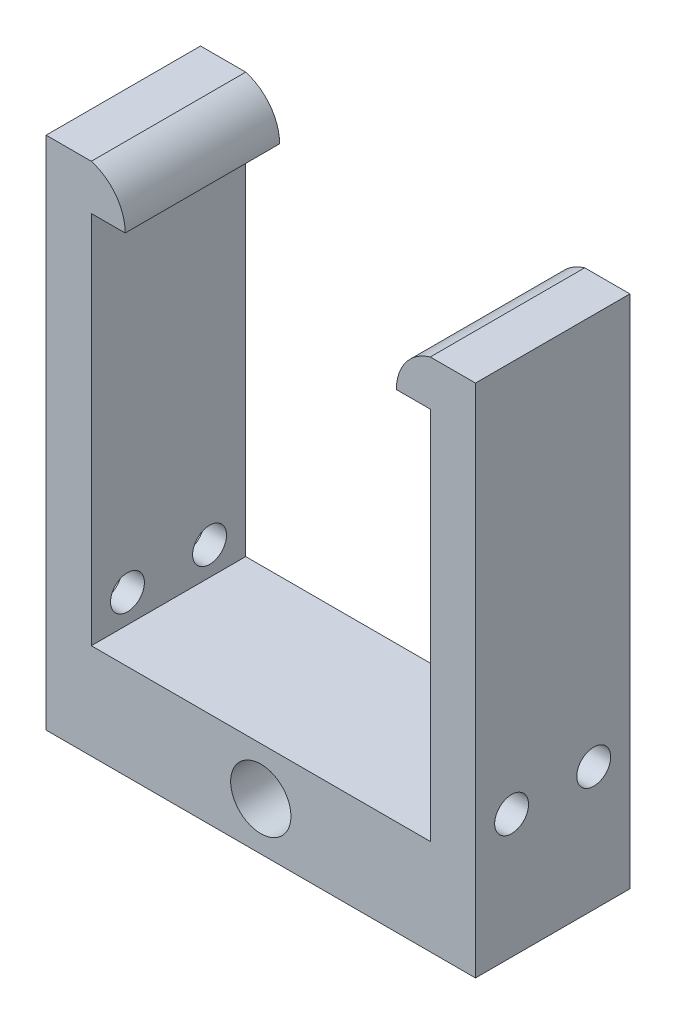
ISO-10303-21;
HEADER;
FILE_DESCRIPTION(('STEP AP214'),'2;1');
FILE_NAME('part.step','',(''),(''),'','','');
FILE_SCHEMA(('AUTOMOTIVE_DESIGN { 1 0 10303 214 1 1 1 1 }'));
ENDSEC;
DATA;
#1=APPLICATION_CONTEXT('core data for automotive mechanical design processes');
#2=APPLICATION_PROTOCOL_DEFINITION('international standard','automotive_design',2000,#1);
#3=PRODUCT_CONTEXT('',#1,'mechanical');
#4=PRODUCT('Part','Part','',(#3));
#5=PRODUCT_RELATED_PRODUCT_CATEGORY('part','',(#4));
#6=PRODUCT_DEFINITION_FORMATION('','',#4);
#7=PRODUCT_DEFINITION_CONTEXT('part definition',#1,'design');
#8=PRODUCT_DEFINITION('design','',#6,#7);
#9=PRODUCT_DEFINITION_SHAPE('','',#8);
#10=(LENGTH_UNIT() NAMED_UNIT(*) SI_UNIT(.MILLI.,.METRE.));
#11=(NAMED_UNIT(*) PLANE_ANGLE_UNIT() SI_UNIT($,.RADIAN.));
#12=(NAMED_UNIT(*) SI_UNIT($,.STERADIAN.) SOLID_ANGLE_UNIT());
#13=UNCERTAINTY_MEASURE_WITH_UNIT(LENGTH_MEASURE(1.E-05),#10,'distance_accuracy_value','');
#14=(GEOMETRIC_REPRESENTATION_CONTEXT(3) GLOBAL_UNCERTAINTY_ASSIGNED_CONTEXT((#13)) GLOBAL_UNIT_ASSIGNED_CONTEXT((#10,
#11,#12)) REPRESENTATION_CONTEXT('',''));
#15=CARTESIAN_POINT('',(0.,0.,0.));
#16=DIRECTION('',(0.,0.,1.));
#17=DIRECTION('',(1.,0.,0.));
#18=AXIS2_PLACEMENT_3D('',#15,#16,#17);
#19=CARTESIAN_POINT('',(-28.5,-43.75,-5.45));
#20=DIRECTION('',(1.,0.,0.));
#21=DIRECTION('',(0.,0.,-1.));
#22=AXIS2_PLACEMENT_3D('',#19,#20,#21);
#23=CYLINDRICAL_SURFACE('',#22,2.25);
#24=CARTESIAN_POINT('',(-22.5,-43.75,-5.45));
#25=DIRECTION('',(-1.,0.,0.));
#26=DIRECTION('',(0.,0.,1.));
#27=AXIS2_PLACEMENT_3D('',#24,#25,#26);
#28=CIRCLE('',#27,2.25);
#29=CARTESIAN_POINT('',(-22.5,-43.75,-3.2));
#30=VERTEX_POINT('',#29);
#31=EDGE_CURVE('E350',#30,#30,#28,.T.);
#32=ORIENTED_EDGE('',*,*,#31,.F.);
#33=EDGE_LOOP('',(#32));
#34=FACE_BOUND('',#33,.T.);
#35=CARTESIAN_POINT('',(-25.5,-43.75,-5.45));
#36=DIRECTION('',(-1.,0.,0.));
#37=DIRECTION('',(0.,0.,1.));
#38=AXIS2_PLACEMENT_3D('',#35,#36,#37);
#39=CIRCLE('',#38,2.25);
#40=CARTESIAN_POINT('',(-25.5,-43.75,-3.2));
#41=VERTEX_POINT('',#40);
#42=EDGE_CURVE('E49',#41,#41,#39,.F.);
#43=ORIENTED_EDGE('',*,*,#42,.F.);
#44=EDGE_LOOP('',(#43));
#45=FACE_BOUND('',#44,.T.);
#46=ADVANCED_FACE('F45',(#34,#45),#23,.F.);
#47=CARTESIAN_POINT('',(-24.25,2.2,10.25));
#48=DIRECTION('',(0.,0.,-1.));
#49=DIRECTION('',(-1.,0.,0.));
#50=AXIS2_PLACEMENT_3D('',#47,#48,#49);
#51=CYLINDRICAL_SURFACE('',#50,6.25);
#52=CARTESIAN_POINT('',(-24.25,2.2,-10.25));
#53=DIRECTION('',(0.,0.,1.));
#54=DIRECTION('',(1.,0.,0.));
#55=AXIS2_PLACEMENT_3D('',#52,#53,#54);
#56=CIRCLE('',#55,6.25);
#57=CARTESIAN_POINT('',(-22.5,8.2,-10.25));
#58=VERTEX_POINT('',#57);
#59=CARTESIAN_POINT('',(-18.,2.2,-10.25));
#60=VERTEX_POINT('',#59);
#61=EDGE_CURVE('E364',#58,#60,#56,.F.);
#62=ORIENTED_EDGE('',*,*,#61,.F.);
#63=DIRECTION('',(0.,0.,-1.));
#64=VECTOR('',#63,1.);
#65=CARTESIAN_POINT('',(-22.5,8.2,10.25));
#66=LINE('',#65,#64);
#67=CARTESIAN_POINT('',(-22.5,8.2,10.25));
#68=VERTEX_POINT('',#67);
#69=EDGE_CURVE('E11',#68,#58,#66,.T.);
#70=ORIENTED_EDGE('',*,*,#69,.F.);
#71=CARTESIAN_POINT('',(-24.25,2.2,10.25));
#72=DIRECTION('',(0.,0.,1.));
#73=DIRECTION('',(1.,0.,0.));
#74=AXIS2_PLACEMENT_3D('',#71,#72,#73);
#75=CIRCLE('',#74,6.25);
#76=CARTESIAN_POINT('',(-18.,2.2,10.25));
#77=VERTEX_POINT('',#76);
#78=EDGE_CURVE('E365',#68,#77,#75,.F.);
#79=ORIENTED_EDGE('',*,*,#78,.T.);
#80=DIRECTION('',(0.,0.,-1.));
#81=VECTOR('',#80,1.);
#82=CARTESIAN_POINT('',(-18.,2.2,10.25));
#83=LINE('',#82,#81);
#84=EDGE_CURVE('E413',#77,#60,#83,.T.);
#85=ORIENTED_EDGE('',*,*,#84,.T.);
#86=EDGE_LOOP('',(#62,#70,#79,#85));
#87=FACE_BOUND('',#86,.T.);
#88=ADVANCED_FACE('F47',(#87),#51,.T.);
#89=CARTESIAN_POINT('',(0.,8.20000000000001,10.25));
#90=DIRECTION('',(0.,1.,0.));
#91=DIRECTION('',(-1.,0.,0.));
#92=AXIS2_PLACEMENT_3D('',#89,#90,#91);
#93=PLANE('',#92);
#94=DIRECTION('',(1.,0.,0.));
#95=VECTOR('',#94,1.);
#96=CARTESIAN_POINT('',(0.,8.20000000000001,-10.25));
#97=LINE('',#96,#95);
#98=CARTESIAN_POINT('',(-28.5,8.2,-10.25));
#99=VERTEX_POINT('',#98);
#100=EDGE_CURVE('E417',#99,#58,#97,.T.);
#101=ORIENTED_EDGE('',*,*,#100,.F.);
#102=DIRECTION('',(0.,0.,-1.));
#103=VECTOR('',#102,1.);
#104=CARTESIAN_POINT('',(-28.5,8.2,10.25));
#105=LINE('',#104,#103);
#106=CARTESIAN_POINT('',(-28.5,8.2,10.25));
#107=VERTEX_POINT('',#106);
#108=EDGE_CURVE('E55',#107,#99,#105,.T.);
#109=ORIENTED_EDGE('',*,*,#108,.F.);
#110=DIRECTION('',(1.,0.,0.));
#111=VECTOR('',#110,1.);
#112=CARTESIAN_POINT('',(0.,8.20000000000001,10.25));
#113=LINE('',#112,#111);
#114=EDGE_CURVE('E369',#107,#68,#113,.T.);
#115=ORIENTED_EDGE('',*,*,#114,.T.);
#116=ORIENTED_EDGE('',*,*,#69,.T.);
#117=EDGE_LOOP('',(#101,#109,#115,#116));
#118=FACE_BOUND('',#117,.T.);
#119=ADVANCED_FACE('F515',(#118),#93,.T.);
#120=CARTESIAN_POINT('',(-28.5,0.,10.25));
#121=DIRECTION('',(-1.,0.,0.));
#122=DIRECTION('',(0.,-1.,0.));
#123=AXIS2_PLACEMENT_3D('',#120,#121,#122);
#124=PLANE('',#123);
#125=DIRECTION('',(0.,0.499999999999977,-0.866025403784452));
#126=VECTOR('',#125,1.);
#127=CARTESIAN_POINT('',(-28.5,-41.8349999999999,-2.13312270350559));
#128=LINE('',#127,#126);
#129=CARTESIAN_POINT('',(-28.5,-41.8349999999999,-2.13312270350559));
#130=VERTEX_POINT('',#129);
#131=CARTESIAN_POINT('',(-28.5,-39.9199999999999,-5.45000000000003));
#132=VERTEX_POINT('',#131);
#133=EDGE_CURVE('E63',#130,#132,#128,.T.);
#134=ORIENTED_EDGE('',*,*,#133,.F.);
#135=DIRECTION('',(0.,1.,0.));
#136=VECTOR('',#135,1.);
#137=CARTESIAN_POINT('',(-28.5,-45.6649999999999,-2.1331227035055));
#138=LINE('',#137,#136);
#139=CARTESIAN_POINT('',(-28.5,-45.6649999999999,-2.1331227035055));
#140=VERTEX_POINT('',#139);
#141=EDGE_CURVE('E233',#140,#130,#138,.T.);
#142=ORIENTED_EDGE('',*,*,#141,.F.);
#143=DIRECTION('',(0.,0.500000000000016,0.86602540378443));
#144=VECTOR('',#143,1.);
#145=CARTESIAN_POINT('',(-28.5,-47.5799999999999,-5.44999999999987));
#146=LINE('',#145,#144);
#147=CARTESIAN_POINT('',(-28.5,-47.5799999999999,-5.44999999999987));
#148=VERTEX_POINT('',#147);
#149=EDGE_CURVE('E237',#148,#140,#146,.T.);
#150=ORIENTED_EDGE('',*,*,#149,.F.);
#151=DIRECTION('',(0.,-0.499999999999966,0.866025403784458));
#152=VECTOR('',#151,1.);
#153=CARTESIAN_POINT('',(-28.5,-45.665,-8.7668772964944));
#154=LINE('',#153,#152);
#155=CARTESIAN_POINT('',(-28.5,-45.665,-8.7668772964944));
#156=VERTEX_POINT('',#155);
#157=EDGE_CURVE('E260',#156,#148,#154,.T.);
#158=ORIENTED_EDGE('',*,*,#157,.F.);
#159=DIRECTION('',(0.,-1.,0.));
#160=VECTOR('',#159,1.);
#161=CARTESIAN_POINT('',(-28.5,-41.835,-8.7668772964944));
#162=LINE('',#161,#160);
#163=CARTESIAN_POINT('',(-28.5,-41.835,-8.7668772964944));
#164=VERTEX_POINT('',#163);
#165=EDGE_CURVE('E256',#164,#156,#162,.T.);
#166=ORIENTED_EDGE('',*,*,#165,.F.);
#167=DIRECTION('',(0.,-0.500000000000022,-0.866025403784426));
#168=VECTOR('',#167,1.);
#169=CARTESIAN_POINT('',(-28.5,-39.9199999999999,-5.45000000000003));
#170=LINE('',#169,#168);
#171=EDGE_CURVE('E253',#132,#164,#170,.T.);
#172=ORIENTED_EDGE('',*,*,#171,.F.);
#173=EDGE_LOOP('',(#134,#142,#150,#158,#166,#172));
#174=FACE_BOUND('',#173,.T.);
#175=DIRECTION('',(0.,1.,0.));
#176=VECTOR('',#175,1.);
#177=CARTESIAN_POINT('',(-28.5,-41.835,8.7668772964944));
#178=LINE('',#177,#176);
#179=CARTESIAN_POINT('',(-28.5,-45.665,8.7668772964944));
#180=VERTEX_POINT('',#179);
#181=CARTESIAN_POINT('',(-28.5,-41.835,8.7668772964944));
#182=VERTEX_POINT('',#181);
#183=EDGE_CURVE('E71',#180,#182,#178,.T.);
#184=ORIENTED_EDGE('',*,*,#183,.F.);
#185=DIRECTION('',(0.,0.5,0.866025403784439));
#186=VECTOR('',#185,1.);
#187=CARTESIAN_POINT('',(-28.5,-45.665,8.7668772964944));
#188=LINE('',#187,#186);
#189=CARTESIAN_POINT('',(-28.5,-47.58,5.45));
#190=VERTEX_POINT('',#189);
#191=EDGE_CURVE('E301',#190,#180,#188,.T.);
#192=ORIENTED_EDGE('',*,*,#191,.F.);
#193=DIRECTION('',(0.,-0.5,0.866025403784439));
#194=VECTOR('',#193,1.);
#195=CARTESIAN_POINT('',(-28.5,-47.58,5.45));
#196=LINE('',#195,#194);
#197=CARTESIAN_POINT('',(-28.5,-45.665,2.1331227035056));
#198=VERTEX_POINT('',#197);
#199=EDGE_CURVE('E305',#198,#190,#196,.T.);
#200=ORIENTED_EDGE('',*,*,#199,.F.);
#201=DIRECTION('',(0.,-1.,0.));
#202=VECTOR('',#201,1.);
#203=CARTESIAN_POINT('',(-28.5,-45.665,2.1331227035056));
#204=LINE('',#203,#202);
#205=CARTESIAN_POINT('',(-28.5,-41.835,2.1331227035056));
#206=VERTEX_POINT('',#205);
#207=EDGE_CURVE('E310',#206,#198,#204,.T.);
#208=ORIENTED_EDGE('',*,*,#207,.F.);
#209=DIRECTION('',(0.,-0.5,-0.866025403784439));
#210=VECTOR('',#209,1.);
#211=CARTESIAN_POINT('',(-28.5,-41.835,2.1331227035056));
#212=LINE('',#211,#210);
#213=CARTESIAN_POINT('',(-28.5,-39.92,5.45));
#214=VERTEX_POINT('',#213);
#215=EDGE_CURVE('E314',#214,#206,#212,.T.);
#216=ORIENTED_EDGE('',*,*,#215,.F.);
#217=DIRECTION('',(0.,0.5,-0.866025403784439));
#218=VECTOR('',#217,1.);
#219=CARTESIAN_POINT('',(-28.5,-39.92,5.45));
#220=LINE('',#219,#218);
#221=EDGE_CURVE('E318',#182,#214,#220,.T.);
#222=ORIENTED_EDGE('',*,*,#221,.F.);
#223=EDGE_LOOP('',(#184,#192,#200,#208,#216,#222));
#224=FACE_BOUND('',#223,.T.);
#225=DIRECTION('',(0.,1.,0.));
#226=VECTOR('',#225,1.);
#227=CARTESIAN_POINT('',(-28.5,0.,-10.25));
#228=LINE('',#227,#226);
#229=CARTESIAN_POINT('',(-28.5,-60.2,-10.25));
#230=VERTEX_POINT('',#229);
#231=EDGE_CURVE('E421',#230,#99,#228,.T.);
#232=ORIENTED_EDGE('',*,*,#231,.F.);
#233=DIRECTION('',(0.,0.,-1.));
#234=VECTOR('',#233,1.);
#235=CARTESIAN_POINT('',(-28.5,-60.2,10.25));
#236=LINE('',#235,#234);
#237=CARTESIAN_POINT('',(-28.5,-60.2,10.25));
#238=VERTEX_POINT('',#237);
#239=EDGE_CURVE('E490',#238,#230,#236,.T.);
#240=ORIENTED_EDGE('',*,*,#239,.F.);
#241=DIRECTION('',(0.,1.,0.));
#242=VECTOR('',#241,1.);
#243=CARTESIAN_POINT('',(-28.5,0.,10.25));
#244=LINE('',#243,#242);
#245=EDGE_CURVE('E374',#238,#107,#244,.T.);
#246=ORIENTED_EDGE('',*,*,#245,.T.);
#247=ORIENTED_EDGE('',*,*,#108,.T.);
#248=EDGE_LOOP('',(#232,#240,#246,#247));
#249=FACE_BOUND('',#248,.T.);
#250=ADVANCED_FACE('F575',(#174,#224,#249),#124,.T.);
#251=CARTESIAN_POINT('',(0.,-60.2,10.25));
#252=DIRECTION('',(0.,-1.,0.));
#253=DIRECTION('',(0.,0.,-1.));
#254=AXIS2_PLACEMENT_3D('',#251,#252,#253);
#255=PLANE('',#254);
#256=DIRECTION('',(-1.,0.,0.));
#257=VECTOR('',#256,1.);
#258=CARTESIAN_POINT('',(0.,-60.2,-10.25));
#259=LINE('',#258,#257);
#260=CARTESIAN_POINT('',(28.5,-60.2,-10.25));
#261=VERTEX_POINT('',#260);
#262=EDGE_CURVE('E425',#261,#230,#259,.T.);
#263=ORIENTED_EDGE('',*,*,#262,.F.);
#264=DIRECTION('',(0.,0.,-1.));
#265=VECTOR('',#264,1.);
#266=CARTESIAN_POINT('',(28.5,-60.2,10.25));
#267=LINE('',#266,#265);
#268=CARTESIAN_POINT('',(28.5,-60.2,10.25));
#269=VERTEX_POINT('',#268);
#270=EDGE_CURVE('E487',#269,#261,#267,.T.);
#271=ORIENTED_EDGE('',*,*,#270,.F.);
#272=DIRECTION('',(-1.,0.,0.));
#273=VECTOR('',#272,1.);
#274=CARTESIAN_POINT('',(0.,-60.2,10.25));
#275=LINE('',#274,#273);
#276=EDGE_CURVE('E378',#269,#238,#275,.T.);
#277=ORIENTED_EDGE('',*,*,#276,.T.);
#278=ORIENTED_EDGE('',*,*,#239,.T.);
#279=EDGE_LOOP('',(#263,#271,#277,#278));
#280=FACE_BOUND('',#279,.T.);
#281=ADVANCED_FACE('F539',(#280),#255,.T.);
#282=CARTESIAN_POINT('',(28.5,0.,10.25));
#283=DIRECTION('',(-1.,0.,0.));
#284=DIRECTION('',(0.,0.,1.));
#285=AXIS2_PLACEMENT_3D('',#282,#283,#284);
#286=PLANE('',#285);
#287=CARTESIAN_POINT('',(28.5,-43.75,5.45));
#288=DIRECTION('',(1.,0.,0.));
#289=DIRECTION('',(0.,0.,-1.));
#290=AXIS2_PLACEMENT_3D('',#287,#288,#289);
#291=CIRCLE('',#290,2.25);
#292=CARTESIAN_POINT('',(28.5,-43.75,3.2));
#293=VERTEX_POINT('',#292);
#294=EDGE_CURVE('E346',#293,#293,#291,.T.);
#295=ORIENTED_EDGE('',*,*,#294,.F.);
#296=EDGE_LOOP('',(#295));
#297=FACE_BOUND('',#296,.T.);
#298=CARTESIAN_POINT('',(28.5,-43.75,-5.45));
#299=DIRECTION('',(1.,0.,0.));
#300=DIRECTION('',(0.,0.,1.));
#301=AXIS2_PLACEMENT_3D('',#298,#299,#300);
#302=CIRCLE('',#301,2.25);
#303=CARTESIAN_POINT('',(28.5,-43.75,-3.2));
#304=VERTEX_POINT('',#303);
#305=EDGE_CURVE('E351',#304,#304,#302,.T.);
#306=ORIENTED_EDGE('',*,*,#305,.F.);
#307=EDGE_LOOP('',(#306));
#308=FACE_BOUND('',#307,.T.);
#309=DIRECTION('',(0.,1.,0.));
#310=VECTOR('',#309,1.);
#311=CARTESIAN_POINT('',(28.5,0.,-10.25));
#312=LINE('',#311,#310);
#313=CARTESIAN_POINT('',(28.5,8.2,-10.25));
#314=VERTEX_POINT('',#313);
#315=EDGE_CURVE('E429',#261,#314,#312,.T.);
#316=ORIENTED_EDGE('',*,*,#315,.T.);
#317=DIRECTION('',(0.,0.,-1.));
#318=VECTOR('',#317,1.);
#319=CARTESIAN_POINT('',(28.5,8.2,10.25));
#320=LINE('',#319,#318);
#321=CARTESIAN_POINT('',(28.5,8.2,10.25));
#322=VERTEX_POINT('',#321);
#323=EDGE_CURVE('E483',#322,#314,#320,.T.);
#324=ORIENTED_EDGE('',*,*,#323,.F.);
#325=DIRECTION('',(0.,1.,0.));
#326=VECTOR('',#325,1.);
#327=CARTESIAN_POINT('',(28.5,0.,10.25));
#328=LINE('',#327,#326);
#329=EDGE_CURVE('E382',#269,#322,#328,.T.);
#330=ORIENTED_EDGE('',*,*,#329,.F.);
#331=ORIENTED_EDGE('',*,*,#270,.T.);
#332=EDGE_LOOP('',(#316,#324,#330,#331));
#333=FACE_BOUND('',#332,.T.);
#334=ADVANCED_FACE('F535',(#297,#308,#333),#286,.F.);
#335=CARTESIAN_POINT('',(0.,8.20000000000001,10.25));
#336=DIRECTION('',(0.,-1.,0.));
#337=DIRECTION('',(1.,0.,0.));
#338=AXIS2_PLACEMENT_3D('',#335,#336,#337);
#339=PLANE('',#338);
#340=DIRECTION('',(-1.,0.,0.));
#341=VECTOR('',#340,1.);
#342=CARTESIAN_POINT('',(0.,8.20000000000001,-10.25));
#343=LINE('',#342,#341);
#344=CARTESIAN_POINT('',(22.5,8.2,-10.25));
#345=VERTEX_POINT('',#344);
#346=EDGE_CURVE('E432',#314,#345,#343,.T.);
#347=ORIENTED_EDGE('',*,*,#346,.T.);
#348=DIRECTION('',(0.,0.,-1.));
#349=VECTOR('',#348,1.);
#350=CARTESIAN_POINT('',(22.5,8.2,10.25));
#351=LINE('',#350,#349);
#352=CARTESIAN_POINT('',(22.5,8.2,10.25));
#353=VERTEX_POINT('',#352);
#354=EDGE_CURVE('E479',#353,#345,#351,.T.);
#355=ORIENTED_EDGE('',*,*,#354,.F.);
#356=DIRECTION('',(-1.,0.,0.));
#357=VECTOR('',#356,1.);
#358=CARTESIAN_POINT('',(0.,8.20000000000001,10.25));
#359=LINE('',#358,#357);
#360=EDGE_CURVE('E385',#322,#353,#359,.T.);
#361=ORIENTED_EDGE('',*,*,#360,.F.);
#362=ORIENTED_EDGE('',*,*,#323,.T.);
#363=EDGE_LOOP('',(#347,#355,#361,#362));
#364=FACE_BOUND('',#363,.T.);
#365=ADVANCED_FACE('F538',(#364),#339,.F.);
#366=CARTESIAN_POINT('',(24.25,2.2,10.25));
#367=DIRECTION('',(0.,0.,-1.));
#368=DIRECTION('',(-1.,0.,0.));
#369=AXIS2_PLACEMENT_3D('',#366,#367,#368);
#370=CYLINDRICAL_SURFACE('',#369,6.25);
#371=CARTESIAN_POINT('',(24.25,2.2,-10.25));
#372=DIRECTION('',(0.,0.,1.));
#373=DIRECTION('',(1.,0.,0.));
#374=AXIS2_PLACEMENT_3D('',#371,#372,#373);
#375=CIRCLE('',#374,6.25);
#376=CARTESIAN_POINT('',(18.,2.2,-10.25));
#377=VERTEX_POINT('',#376);
#378=EDGE_CURVE('E435',#345,#377,#375,.T.);
#379=ORIENTED_EDGE('',*,*,#378,.T.);
#380=DIRECTION('',(0.,0.,-1.));
#381=VECTOR('',#380,1.);
#382=CARTESIAN_POINT('',(18.,2.2,10.25));
#383=LINE('',#382,#381);
#384=CARTESIAN_POINT('',(18.,2.2,10.25));
#385=VERTEX_POINT('',#384);
#386=EDGE_CURVE('E475',#385,#377,#383,.T.);
#387=ORIENTED_EDGE('',*,*,#386,.F.);
#388=CARTESIAN_POINT('',(24.25,2.2,10.25));
#389=DIRECTION('',(0.,0.,1.));
#390=DIRECTION('',(1.,0.,0.));
#391=AXIS2_PLACEMENT_3D('',#388,#389,#390);
#392=CIRCLE('',#391,6.25);
#393=EDGE_CURVE('E388',#353,#385,#392,.T.);
#394=ORIENTED_EDGE('',*,*,#393,.F.);
#395=ORIENTED_EDGE('',*,*,#354,.T.);
#396=EDGE_LOOP('',(#379,#387,#394,#395));
#397=FACE_BOUND('',#396,.T.);
#398=ADVANCED_FACE('F556',(#397),#370,.T.);
#399=CARTESIAN_POINT('',(0.,2.19999999999999,10.25));
#400=DIRECTION('',(0.,1.,0.));
#401=DIRECTION('',(-1.,0.,0.));
#402=AXIS2_PLACEMENT_3D('',#399,#400,#401);
#403=PLANE('',#402);
#404=DIRECTION('',(1.,0.,0.));
#405=VECTOR('',#404,1.);
#406=CARTESIAN_POINT('',(0.,2.19999999999999,-10.25));
#407=LINE('',#406,#405);
#408=CARTESIAN_POINT('',(22.5,2.2,-10.25));
#409=VERTEX_POINT('',#408);
#410=EDGE_CURVE('E438',#377,#409,#407,.T.);
#411=ORIENTED_EDGE('',*,*,#410,.T.);
#412=DIRECTION('',(0.,0.,-1.));
#413=VECTOR('',#412,1.);
#414=CARTESIAN_POINT('',(22.5,2.2,10.25));
#415=LINE('',#414,#413);
#416=CARTESIAN_POINT('',(22.5,2.2,10.25));
#417=VERTEX_POINT('',#416);
#418=EDGE_CURVE('E472',#417,#409,#415,.T.);
#419=ORIENTED_EDGE('',*,*,#418,.F.);
#420=DIRECTION('',(1.,0.,0.));
#421=VECTOR('',#420,1.);
#422=CARTESIAN_POINT('',(0.,2.19999999999999,10.25));
#423=LINE('',#422,#421);
#424=EDGE_CURVE('E391',#385,#417,#423,.T.);
#425=ORIENTED_EDGE('',*,*,#424,.F.);
#426=ORIENTED_EDGE('',*,*,#386,.T.);
#427=EDGE_LOOP('',(#411,#419,#425,#426));
#428=FACE_BOUND('',#427,.T.);
#429=ADVANCED_FACE('F560',(#428),#403,.F.);
#430=CARTESIAN_POINT('',(22.5,0.,10.25));
#431=DIRECTION('',(-1.,0.,0.));
#432=DIRECTION('',(0.,0.,1.));
#433=AXIS2_PLACEMENT_3D('',#430,#431,#432);
#434=PLANE('',#433);
#435=CARTESIAN_POINT('',(22.5,-43.75,5.45));
#436=DIRECTION('',(-1.,0.,0.));
#437=DIRECTION('',(0.,0.,1.));
#438=AXIS2_PLACEMENT_3D('',#435,#436,#437);
#439=CIRCLE('',#438,2.25);
#440=CARTESIAN_POINT('',(22.5,-43.75,7.7));
#441=VERTEX_POINT('',#440);
#442=EDGE_CURVE('E360',#441,#441,#439,.T.);
#443=ORIENTED_EDGE('',*,*,#442,.F.);
#444=EDGE_LOOP('',(#443));
#445=FACE_BOUND('',#444,.T.);
#446=CARTESIAN_POINT('',(22.5,-43.75,-5.45));
#447=DIRECTION('',(-1.,0.,0.));
#448=DIRECTION('',(0.,0.,1.));
#449=AXIS2_PLACEMENT_3D('',#446,#447,#448);
#450=CIRCLE('',#449,2.25);
#451=CARTESIAN_POINT('',(22.5,-43.75,-3.2));
#452=VERTEX_POINT('',#451);
#453=EDGE_CURVE('E355',#452,#452,#450,.T.);
#454=ORIENTED_EDGE('',*,*,#453,.F.);
#455=EDGE_LOOP('',(#454));
#456=FACE_BOUND('',#455,.T.);
#457=DIRECTION('',(0.,1.,0.));
#458=VECTOR('',#457,1.);
#459=CARTESIAN_POINT('',(22.5,0.,-10.25));
#460=LINE('',#459,#458);
#461=CARTESIAN_POINT('',(22.5,-47.5,-10.25));
#462=VERTEX_POINT('',#461);
#463=EDGE_CURVE('E442',#462,#409,#460,.T.);
#464=ORIENTED_EDGE('',*,*,#463,.F.);
#465=DIRECTION('',(0.,0.,-1.));
#466=VECTOR('',#465,1.);
#467=CARTESIAN_POINT('',(22.5,-47.5,10.25));
#468=LINE('',#467,#466);
#469=CARTESIAN_POINT('',(22.5,-47.5,10.25));
#470=VERTEX_POINT('',#469);
#471=EDGE_CURVE('E469',#470,#462,#468,.T.);
#472=ORIENTED_EDGE('',*,*,#471,.F.);
#473=DIRECTION('',(0.,1.,0.));
#474=VECTOR('',#473,1.);
#475=CARTESIAN_POINT('',(22.5,0.,10.25));
#476=LINE('',#475,#474);
#477=EDGE_CURVE('E394',#470,#417,#476,.T.);
#478=ORIENTED_EDGE('',*,*,#477,.T.);
#479=ORIENTED_EDGE('',*,*,#418,.T.);
#480=EDGE_LOOP('',(#464,#472,#478,#479));
#481=FACE_BOUND('',#480,.T.);
#482=ADVANCED_FACE('F592',(#445,#456,#481),#434,.T.);
#483=CARTESIAN_POINT('',(0.,-47.5,10.25));
#484=DIRECTION('',(0.,1.,0.));
#485=DIRECTION('',(0.,0.,1.));
#486=AXIS2_PLACEMENT_3D('',#483,#484,#485);
#487=PLANE('',#486);
#488=DIRECTION('',(1.,0.,0.));
#489=VECTOR('',#488,1.);
#490=CARTESIAN_POINT('',(0.,-47.5,-10.25));
#491=LINE('',#490,#489);
#492=CARTESIAN_POINT('',(-22.5,-47.5,-10.25));
#493=VERTEX_POINT('',#492);
#494=EDGE_CURVE('E446',#493,#462,#491,.T.);
#495=ORIENTED_EDGE('',*,*,#494,.F.);
#496=DIRECTION('',(0.,0.,-1.));
#497=VECTOR('',#496,1.);
#498=CARTESIAN_POINT('',(-22.5,-47.5,10.25));
#499=LINE('',#498,#497);
#500=CARTESIAN_POINT('',(-22.5,-47.5,10.25));
#501=VERTEX_POINT('',#500);
#502=EDGE_CURVE('E466',#501,#493,#499,.T.);
#503=ORIENTED_EDGE('',*,*,#502,.F.);
#504=DIRECTION('',(1.,0.,0.));
#505=VECTOR('',#504,1.);
#506=CARTESIAN_POINT('',(0.,-47.5,10.25));
#507=LINE('',#506,#505);
#508=EDGE_CURVE('E398',#501,#470,#507,.T.);
#509=ORIENTED_EDGE('',*,*,#508,.T.);
#510=ORIENTED_EDGE('',*,*,#471,.T.);
#511=EDGE_LOOP('',(#495,#503,#509,#510));
#512=FACE_BOUND('',#511,.T.);
#513=ADVANCED_FACE('F589',(#512),#487,.T.);
#514=CARTESIAN_POINT('',(-22.5,0.,10.25));
#515=DIRECTION('',(-1.,0.,0.));
#516=DIRECTION('',(0.,0.,1.));
#517=AXIS2_PLACEMENT_3D('',#514,#515,#516);
#518=PLANE('',#517);
#519=CARTESIAN_POINT('',(-22.5,-43.75,5.45));
#520=DIRECTION('',(-1.,0.,0.));
#521=DIRECTION('',(0.,0.,1.));
#522=AXIS2_PLACEMENT_3D('',#519,#520,#521);
#523=CIRCLE('',#522,2.25);
#524=CARTESIAN_POINT('',(-22.5,-43.75,7.7));
#525=VERTEX_POINT('',#524);
#526=EDGE_CURVE('E359',#525,#525,#523,.T.);
#527=ORIENTED_EDGE('',*,*,#526,.T.);
#528=EDGE_LOOP('',(#527));
#529=FACE_BOUND('',#528,.T.);
#530=ORIENTED_EDGE('',*,*,#31,.T.);
#531=EDGE_LOOP('',(#530));
#532=FACE_BOUND('',#531,.T.);
#533=DIRECTION('',(0.,1.,0.));
#534=VECTOR('',#533,1.);
#535=CARTESIAN_POINT('',(-22.5,0.,-10.25));
#536=LINE('',#535,#534);
#537=CARTESIAN_POINT('',(-22.5,2.2,-10.25));
#538=VERTEX_POINT('',#537);
#539=EDGE_CURVE('E450',#493,#538,#536,.T.);
#540=ORIENTED_EDGE('',*,*,#539,.T.);
#541=DIRECTION('',(0.,0.,-1.));
#542=VECTOR('',#541,1.);
#543=CARTESIAN_POINT('',(-22.5,2.2,10.25));
#544=LINE('',#543,#542);
#545=CARTESIAN_POINT('',(-22.5,2.2,10.25));
#546=VERTEX_POINT('',#545);
#547=EDGE_CURVE('E463',#546,#538,#544,.T.);
#548=ORIENTED_EDGE('',*,*,#547,.F.);
#549=DIRECTION('',(0.,1.,0.));
#550=VECTOR('',#549,1.);
#551=CARTESIAN_POINT('',(-22.5,0.,10.25));
#552=LINE('',#551,#550);
#553=EDGE_CURVE('E402',#501,#546,#552,.T.);
#554=ORIENTED_EDGE('',*,*,#553,.F.);
#555=ORIENTED_EDGE('',*,*,#502,.T.);
#556=EDGE_LOOP('',(#540,#548,#554,#555));
#557=FACE_BOUND('',#556,.T.);
#558=ADVANCED_FACE('F586',(#529,#532,#557),#518,.F.);
#559=CARTESIAN_POINT('',(0.,2.19999999999999,10.25));
#560=DIRECTION('',(0.,-1.,0.));
#561=DIRECTION('',(1.,0.,0.));
#562=AXIS2_PLACEMENT_3D('',#559,#560,#561);
#563=PLANE('',#562);
#564=DIRECTION('',(-1.,0.,0.));
#565=VECTOR('',#564,1.);
#566=CARTESIAN_POINT('',(0.,2.19999999999999,-10.25));
#567=LINE('',#566,#565);
#568=EDGE_CURVE('E454',#60,#538,#567,.T.);
#569=ORIENTED_EDGE('',*,*,#568,.F.);
#570=ORIENTED_EDGE('',*,*,#84,.F.);
#571=DIRECTION('',(-1.,0.,0.));
#572=VECTOR('',#571,1.);
#573=CARTESIAN_POINT('',(0.,2.19999999999999,10.25));
#574=LINE('',#573,#572);
#575=EDGE_CURVE('E405',#77,#546,#574,.T.);
#576=ORIENTED_EDGE('',*,*,#575,.T.);
#577=ORIENTED_EDGE('',*,*,#547,.T.);
#578=EDGE_LOOP('',(#569,#570,#576,#577));
#579=FACE_BOUND('',#578,.T.);
#580=ADVANCED_FACE('F581',(#579),#563,.T.);
#581=CARTESIAN_POINT('',(0.,-53.85,10.25));
#582=DIRECTION('',(0.,0.,-1.));
#583=DIRECTION('',(-1.,0.,0.));
#584=AXIS2_PLACEMENT_3D('',#581,#582,#583);
#585=CYLINDRICAL_SURFACE('',#584,4.);
#586=CARTESIAN_POINT('',(0.,-53.85,10.25));
#587=DIRECTION('',(0.,0.,1.));
#588=DIRECTION('',(1.,0.,0.));
#589=AXIS2_PLACEMENT_3D('',#586,#587,#588);
#590=CIRCLE('',#589,4.);
#591=CARTESIAN_POINT('',(4.,-53.85,10.25));
#592=VERTEX_POINT('',#591);
#593=EDGE_CURVE('E409',#592,#592,#590,.T.);
#594=ORIENTED_EDGE('',*,*,#593,.T.);
#595=EDGE_LOOP('',(#594));
#596=FACE_BOUND('',#595,.T.);
#597=CARTESIAN_POINT('',(0.,-53.85,-10.25));
#598=DIRECTION('',(0.,0.,1.));
#599=DIRECTION('',(1.,0.,0.));
#600=AXIS2_PLACEMENT_3D('',#597,#598,#599);
#601=CIRCLE('',#600,4.);
#602=CARTESIAN_POINT('',(4.,-53.85,-10.25));
#603=VERTEX_POINT('',#602);
#604=EDGE_CURVE('E370',#603,#603,#601,.T.);
#605=ORIENTED_EDGE('',*,*,#604,.F.);
#606=EDGE_LOOP('',(#605));
#607=FACE_BOUND('',#606,.T.);
#608=ADVANCED_FACE('F696',(#596,#607),#585,.F.);
#609=CARTESIAN_POINT('',(0.,0.,10.25));
#610=DIRECTION('',(0.,0.,1.));
#611=DIRECTION('',(1.,0.,0.));
#612=AXIS2_PLACEMENT_3D('',#609,#610,#611);
#613=PLANE('',#612);
#614=ORIENTED_EDGE('',*,*,#78,.F.);
#615=ORIENTED_EDGE('',*,*,#114,.F.);
#616=ORIENTED_EDGE('',*,*,#245,.F.);
#617=ORIENTED_EDGE('',*,*,#276,.F.);
#618=ORIENTED_EDGE('',*,*,#329,.T.);
#619=ORIENTED_EDGE('',*,*,#360,.T.);
#620=ORIENTED_EDGE('',*,*,#393,.T.);
#621=ORIENTED_EDGE('',*,*,#424,.T.);
#622=ORIENTED_EDGE('',*,*,#477,.F.);
#623=ORIENTED_EDGE('',*,*,#508,.F.);
#624=ORIENTED_EDGE('',*,*,#553,.T.);
#625=ORIENTED_EDGE('',*,*,#575,.F.);
#626=EDGE_LOOP('',(#614,#615,#616,#617,#618,#619,#620,#621,#622,#623,#624,#625));
#627=FACE_BOUND('',#626,.T.);
#628=ORIENTED_EDGE('',*,*,#593,.F.);
#629=EDGE_LOOP('',(#628));
#630=FACE_BOUND('',#629,.T.);
#631=ADVANCED_FACE('F565',(#627,#630),#613,.T.);
#632=CARTESIAN_POINT('',(0.,0.,-10.25));
#633=DIRECTION('',(0.,0.,1.));
#634=DIRECTION('',(1.,0.,0.));
#635=AXIS2_PLACEMENT_3D('',#632,#633,#634);
#636=PLANE('',#635);
#637=ORIENTED_EDGE('',*,*,#61,.T.);
#638=ORIENTED_EDGE('',*,*,#568,.T.);
#639=ORIENTED_EDGE('',*,*,#539,.F.);
#640=ORIENTED_EDGE('',*,*,#494,.T.);
#641=ORIENTED_EDGE('',*,*,#463,.T.);
#642=ORIENTED_EDGE('',*,*,#410,.F.);
#643=ORIENTED_EDGE('',*,*,#378,.F.);
#644=ORIENTED_EDGE('',*,*,#346,.F.);
#645=ORIENTED_EDGE('',*,*,#315,.F.);
#646=ORIENTED_EDGE('',*,*,#262,.T.);
#647=ORIENTED_EDGE('',*,*,#231,.T.);
#648=ORIENTED_EDGE('',*,*,#100,.T.);
#649=EDGE_LOOP('',(#637,#638,#639,#640,#641,#642,#643,#644,#645,#646,#647,#648));
#650=FACE_BOUND('',#649,.T.);
#651=ORIENTED_EDGE('',*,*,#604,.T.);
#652=EDGE_LOOP('',(#651));
#653=FACE_BOUND('',#652,.T.);
#654=ADVANCED_FACE('F530',(#650,#653),#636,.F.);
#655=CARTESIAN_POINT('',(-28.5,-43.75,5.45));
#656=DIRECTION('',(1.,0.,0.));
#657=DIRECTION('',(0.,0.,-1.));
#658=AXIS2_PLACEMENT_3D('',#655,#656,#657);
#659=CYLINDRICAL_SURFACE('',#658,2.25);
#660=CARTESIAN_POINT('',(-25.5,-43.75,5.45));
#661=DIRECTION('',(1.,0.,0.));
#662=DIRECTION('',(0.,1.,0.));
#663=AXIS2_PLACEMENT_3D('',#660,#661,#662);
#664=CIRCLE('',#663,2.25);
#665=CARTESIAN_POINT('',(-25.5,-41.5,5.45));
#666=VERTEX_POINT('',#665);
#667=EDGE_CURVE('E270',#666,#666,#664,.F.);
#668=ORIENTED_EDGE('',*,*,#667,.T.);
#669=EDGE_LOOP('',(#668));
#670=FACE_BOUND('',#669,.T.);
#671=ORIENTED_EDGE('',*,*,#526,.F.);
#672=EDGE_LOOP('',(#671));
#673=FACE_BOUND('',#672,.T.);
#674=ADVANCED_FACE('F522',(#670,#673),#659,.F.);
#675=ORIENTED_EDGE('',*,*,#453,.T.);
#676=EDGE_LOOP('',(#675));
#677=FACE_BOUND('',#676,.T.);
#678=ORIENTED_EDGE('',*,*,#305,.T.);
#679=EDGE_LOOP('',(#678));
#680=FACE_BOUND('',#679,.T.);
#681=ADVANCED_FACE('F511',(#677,#680),#23,.F.);
#682=ORIENTED_EDGE('',*,*,#442,.T.);
#683=EDGE_LOOP('',(#682));
#684=FACE_BOUND('',#683,.T.);
#685=ORIENTED_EDGE('',*,*,#294,.T.);
#686=EDGE_LOOP('',(#685));
#687=FACE_BOUND('',#686,.T.);
#688=ADVANCED_FACE('F521',(#684,#687),#659,.F.);
#689=CARTESIAN_POINT('',(-25.5,0.,0.));
#690=DIRECTION('',(1.,0.,0.));
#691=DIRECTION('',(0.,1.,0.));
#692=AXIS2_PLACEMENT_3D('',#689,#690,#691);
#693=PLANE('',#692);
#694=DIRECTION('',(0.,1.,0.));
#695=VECTOR('',#694,1.);
#696=CARTESIAN_POINT('',(-25.5,-41.835,8.7668772964944));
#697=LINE('',#696,#695);
#698=CARTESIAN_POINT('',(-25.5,-45.665,8.7668772964944));
#699=VERTEX_POINT('',#698);
#700=CARTESIAN_POINT('',(-25.5,-41.835,8.7668772964944));
#701=VERTEX_POINT('',#700);
#702=EDGE_CURVE('E306',#699,#701,#697,.T.);
#703=ORIENTED_EDGE('',*,*,#702,.T.);
#704=DIRECTION('',(0.,0.5,-0.866025403784439));
#705=VECTOR('',#704,1.);
#706=CARTESIAN_POINT('',(-25.5,-39.92,5.45));
#707=LINE('',#706,#705);
#708=CARTESIAN_POINT('',(-25.5,-39.92,5.45));
#709=VERTEX_POINT('',#708);
#710=EDGE_CURVE('E339',#701,#709,#707,.T.);
#711=ORIENTED_EDGE('',*,*,#710,.T.);
#712=DIRECTION('',(0.,-0.5,-0.866025403784439));
#713=VECTOR('',#712,1.);
#714=CARTESIAN_POINT('',(-25.5,-41.835,2.1331227035056));
#715=LINE('',#714,#713);
#716=CARTESIAN_POINT('',(-25.5,-41.835,2.1331227035056));
#717=VERTEX_POINT('',#716);
#718=EDGE_CURVE('E335',#709,#717,#715,.T.);
#719=ORIENTED_EDGE('',*,*,#718,.T.);
#720=DIRECTION('',(0.,-1.,0.));
#721=VECTOR('',#720,1.);
#722=CARTESIAN_POINT('',(-25.5,-45.665,2.1331227035056));
#723=LINE('',#722,#721);
#724=CARTESIAN_POINT('',(-25.5,-45.665,2.1331227035056));
#725=VERTEX_POINT('',#724);
#726=EDGE_CURVE('E331',#717,#725,#723,.T.);
#727=ORIENTED_EDGE('',*,*,#726,.T.);
#728=DIRECTION('',(0.,-0.5,0.866025403784439));
#729=VECTOR('',#728,1.);
#730=CARTESIAN_POINT('',(-25.5,-47.58,5.45));
#731=LINE('',#730,#729);
#732=CARTESIAN_POINT('',(-25.5,-47.58,5.45));
#733=VERTEX_POINT('',#732);
#734=EDGE_CURVE('E327',#725,#733,#731,.T.);
#735=ORIENTED_EDGE('',*,*,#734,.T.);
#736=DIRECTION('',(0.,0.5,0.866025403784439));
#737=VECTOR('',#736,1.);
#738=CARTESIAN_POINT('',(-25.5,-45.665,8.7668772964944));
#739=LINE('',#738,#737);
#740=EDGE_CURVE('E285',#733,#699,#739,.T.);
#741=ORIENTED_EDGE('',*,*,#740,.T.);
#742=EDGE_LOOP('',(#703,#711,#719,#727,#735,#741));
#743=FACE_BOUND('',#742,.T.);
#744=ORIENTED_EDGE('',*,*,#667,.F.);
#745=EDGE_LOOP('',(#744));
#746=FACE_BOUND('',#745,.T.);
#747=ADVANCED_FACE('F528',(#743,#746),#693,.F.);
#748=CARTESIAN_POINT('',(-25.5,-41.835,8.7668772964944));
#749=DIRECTION('',(0.,0.,1.));
#750=DIRECTION('',(1.,0.,0.));
#751=AXIS2_PLACEMENT_3D('',#748,#749,#750);
#752=PLANE('',#751);
#753=ORIENTED_EDGE('',*,*,#183,.T.);
#754=DIRECTION('',(-1.,0.,0.));
#755=VECTOR('',#754,1.);
#756=CARTESIAN_POINT('',(-25.5,-41.835,8.7668772964944));
#757=LINE('',#756,#755);
#758=EDGE_CURVE('E282',#701,#182,#757,.T.);
#759=ORIENTED_EDGE('',*,*,#758,.F.);
#760=ORIENTED_EDGE('',*,*,#702,.F.);
#761=DIRECTION('',(-1.,0.,0.));
#762=VECTOR('',#761,1.);
#763=CARTESIAN_POINT('',(-25.5,-45.665,8.7668772964944));
#764=LINE('',#763,#762);
#765=EDGE_CURVE('E298',#699,#180,#764,.T.);
#766=ORIENTED_EDGE('',*,*,#765,.T.);
#767=EDGE_LOOP('',(#753,#759,#760,#766));
#768=FACE_BOUND('',#767,.T.);
#769=ADVANCED_FACE('F765',(#768),#752,.F.);
#770=CARTESIAN_POINT('',(-25.5,-45.665,8.7668772964944));
#771=DIRECTION('',(0.,-0.866025403784439,0.5));
#772=DIRECTION('',(0.,-0.5,-0.866025403784439));
#773=AXIS2_PLACEMENT_3D('',#770,#771,#772);
#774=PLANE('',#773);
#775=ORIENTED_EDGE('',*,*,#191,.T.);
#776=ORIENTED_EDGE('',*,*,#765,.F.);
#777=ORIENTED_EDGE('',*,*,#740,.F.);
#778=DIRECTION('',(-1.,0.,0.));
#779=VECTOR('',#778,1.);
#780=CARTESIAN_POINT('',(-25.5,-47.58,5.45));
#781=LINE('',#780,#779);
#782=EDGE_CURVE('E295',#733,#190,#781,.T.);
#783=ORIENTED_EDGE('',*,*,#782,.T.);
#784=EDGE_LOOP('',(#775,#776,#777,#783));
#785=FACE_BOUND('',#784,.T.);
#786=ADVANCED_FACE('F776',(#785),#774,.F.);
#787=CARTESIAN_POINT('',(-25.5,-47.58,5.45));
#788=DIRECTION('',(0.,-0.866025403784439,-0.5));
#789=DIRECTION('',(0.,0.5,-0.866025403784439));
#790=AXIS2_PLACEMENT_3D('',#787,#788,#789);
#791=PLANE('',#790);
#792=ORIENTED_EDGE('',*,*,#199,.T.);
#793=ORIENTED_EDGE('',*,*,#782,.F.);
#794=ORIENTED_EDGE('',*,*,#734,.F.);
#795=DIRECTION('',(-1.,0.,0.));
#796=VECTOR('',#795,1.);
#797=CARTESIAN_POINT('',(-25.5,-45.665,2.1331227035056));
#798=LINE('',#797,#796);
#799=EDGE_CURVE('E292',#725,#198,#798,.T.);
#800=ORIENTED_EDGE('',*,*,#799,.T.);
#801=EDGE_LOOP('',(#792,#793,#794,#800));
#802=FACE_BOUND('',#801,.T.);
#803=ADVANCED_FACE('F786',(#802),#791,.F.);
#804=CARTESIAN_POINT('',(-25.5,-45.665,2.1331227035056));
#805=DIRECTION('',(0.,0.,-1.));
#806=DIRECTION('',(0.,1.,0.));
#807=AXIS2_PLACEMENT_3D('',#804,#805,#806);
#808=PLANE('',#807);
#809=ORIENTED_EDGE('',*,*,#207,.T.);
#810=ORIENTED_EDGE('',*,*,#799,.F.);
#811=ORIENTED_EDGE('',*,*,#726,.F.);
#812=DIRECTION('',(-1.,0.,0.));
#813=VECTOR('',#812,1.);
#814=CARTESIAN_POINT('',(-25.5,-41.835,2.1331227035056));
#815=LINE('',#814,#813);
#816=EDGE_CURVE('E289',#717,#206,#815,.T.);
#817=ORIENTED_EDGE('',*,*,#816,.T.);
#818=EDGE_LOOP('',(#809,#810,#811,#817));
#819=FACE_BOUND('',#818,.T.);
#820=ADVANCED_FACE('F797',(#819),#808,.F.);
#821=CARTESIAN_POINT('',(-25.5,-41.835,2.1331227035056));
#822=DIRECTION('',(0.,0.866025403784439,-0.5));
#823=DIRECTION('',(0.,0.5,0.866025403784439));
#824=AXIS2_PLACEMENT_3D('',#821,#822,#823);
#825=PLANE('',#824);
#826=ORIENTED_EDGE('',*,*,#215,.T.);
#827=ORIENTED_EDGE('',*,*,#816,.F.);
#828=ORIENTED_EDGE('',*,*,#718,.F.);
#829=DIRECTION('',(-1.,0.,0.));
#830=VECTOR('',#829,1.);
#831=CARTESIAN_POINT('',(-25.5,-39.92,5.45));
#832=LINE('',#831,#830);
#833=EDGE_CURVE('E286',#709,#214,#832,.T.);
#834=ORIENTED_EDGE('',*,*,#833,.T.);
#835=EDGE_LOOP('',(#826,#827,#828,#834));
#836=FACE_BOUND('',#835,.T.);
#837=ADVANCED_FACE('F808',(#836),#825,.F.);
#838=CARTESIAN_POINT('',(-25.5,-39.92,5.45));
#839=DIRECTION('',(0.,0.866025403784439,0.5));
#840=DIRECTION('',(0.,-0.5,0.866025403784439));
#841=AXIS2_PLACEMENT_3D('',#838,#839,#840);
#842=PLANE('',#841);
#843=ORIENTED_EDGE('',*,*,#221,.T.);
#844=ORIENTED_EDGE('',*,*,#833,.F.);
#845=ORIENTED_EDGE('',*,*,#710,.F.);
#846=ORIENTED_EDGE('',*,*,#758,.T.);
#847=EDGE_LOOP('',(#843,#844,#845,#846));
#848=FACE_BOUND('',#847,.T.);
#849=ADVANCED_FACE('F819',(#848),#842,.F.);
#850=CARTESIAN_POINT('',(-25.5,0.,0.));
#851=DIRECTION('',(-1.,0.,0.));
#852=DIRECTION('',(0.,0.,1.));
#853=AXIS2_PLACEMENT_3D('',#850,#851,#852);
#854=PLANE('',#853);
#855=DIRECTION('',(0.,0.499999999999977,-0.866025403784452));
#856=VECTOR('',#855,1.);
#857=CARTESIAN_POINT('',(-25.5,-41.8349999999999,-2.13312270350559));
#858=LINE('',#857,#856);
#859=CARTESIAN_POINT('',(-25.5,-41.8349999999999,-2.13312270350559));
#860=VERTEX_POINT('',#859);
#861=CARTESIAN_POINT('',(-25.5,-39.9199999999999,-5.45000000000003));
#862=VERTEX_POINT('',#861);
#863=EDGE_CURVE('E210',#860,#862,#858,.T.);
#864=ORIENTED_EDGE('',*,*,#863,.T.);
#865=DIRECTION('',(0.,-0.500000000000022,-0.866025403784426));
#866=VECTOR('',#865,1.);
#867=CARTESIAN_POINT('',(-25.5,-39.9199999999999,-5.45000000000003));
#868=LINE('',#867,#866);
#869=CARTESIAN_POINT('',(-25.5,-41.835,-8.7668772964944));
#870=VERTEX_POINT('',#869);
#871=EDGE_CURVE('E220',#862,#870,#868,.T.);
#872=ORIENTED_EDGE('',*,*,#871,.T.);
#873=DIRECTION('',(0.,-1.,0.));
#874=VECTOR('',#873,1.);
#875=CARTESIAN_POINT('',(-25.5,-41.835,-8.7668772964944));
#876=LINE('',#875,#874);
#877=CARTESIAN_POINT('',(-25.5,-45.665,-8.7668772964944));
#878=VERTEX_POINT('',#877);
#879=EDGE_CURVE('E226',#870,#878,#876,.T.);
#880=ORIENTED_EDGE('',*,*,#879,.T.);
#881=DIRECTION('',(0.,-0.499999999999966,0.866025403784458));
#882=VECTOR('',#881,1.);
#883=CARTESIAN_POINT('',(-25.5,-45.665,-8.7668772964944));
#884=LINE('',#883,#882);
#885=CARTESIAN_POINT('',(-25.5,-47.5799999999999,-5.44999999999987));
#886=VERTEX_POINT('',#885);
#887=EDGE_CURVE('E242',#878,#886,#884,.T.);
#888=ORIENTED_EDGE('',*,*,#887,.T.);
#889=DIRECTION('',(0.,0.500000000000016,0.86602540378443));
#890=VECTOR('',#889,1.);
#891=CARTESIAN_POINT('',(-25.5,-47.5799999999999,-5.44999999999987));
#892=LINE('',#891,#890);
#893=CARTESIAN_POINT('',(-25.5,-45.6649999999999,-2.1331227035055));
#894=VERTEX_POINT('',#893);
#895=EDGE_CURVE('E246',#886,#894,#892,.T.);
#896=ORIENTED_EDGE('',*,*,#895,.T.);
#897=DIRECTION('',(0.,1.,0.));
#898=VECTOR('',#897,1.);
#899=CARTESIAN_POINT('',(-25.5,-45.6649999999999,-2.1331227035055));
#900=LINE('',#899,#898);
#901=EDGE_CURVE('E217',#894,#860,#900,.T.);
#902=ORIENTED_EDGE('',*,*,#901,.T.);
#903=EDGE_LOOP('',(#864,#872,#880,#888,#896,#902));
#904=FACE_BOUND('',#903,.T.);
#905=ORIENTED_EDGE('',*,*,#42,.T.);
#906=EDGE_LOOP('',(#905));
#907=FACE_BOUND('',#906,.T.);
#908=ADVANCED_FACE('F228',(#904,#907),#854,.T.);
#909=CARTESIAN_POINT('',(-25.5,-41.8349999999999,-2.13312270350559));
#910=DIRECTION('',(0.,0.866025403784452,0.499999999999978));
#911=DIRECTION('',(0.,-0.499999999999978,0.866025403784452));
#912=AXIS2_PLACEMENT_3D('',#909,#910,#911);
#913=PLANE('',#912);
#914=ORIENTED_EDGE('',*,*,#133,.T.);
#915=DIRECTION('',(-1.,0.,0.));
#916=VECTOR('',#915,1.);
#917=CARTESIAN_POINT('',(-25.5,-39.9199999999999,-5.45000000000003));
#918=LINE('',#917,#916);
#919=EDGE_CURVE('E206',#862,#132,#918,.T.);
#920=ORIENTED_EDGE('',*,*,#919,.F.);
#921=ORIENTED_EDGE('',*,*,#863,.F.);
#922=DIRECTION('',(-1.,0.,0.));
#923=VECTOR('',#922,1.);
#924=CARTESIAN_POINT('',(-25.5,-41.8349999999999,-2.13312270350559));
#925=LINE('',#924,#923);
#926=EDGE_CURVE('E267',#860,#130,#925,.T.);
#927=ORIENTED_EDGE('',*,*,#926,.T.);
#928=EDGE_LOOP('',(#914,#920,#921,#927));
#929=FACE_BOUND('',#928,.T.);
#930=ADVANCED_FACE('F208',(#929),#913,.F.);
#931=CARTESIAN_POINT('',(-25.5,-45.6649999999999,-2.1331227035055));
#932=DIRECTION('',(0.,0.,1.));
#933=DIRECTION('',(0.,-1.,0.));
#934=AXIS2_PLACEMENT_3D('',#931,#932,#933);
#935=PLANE('',#934);
#936=ORIENTED_EDGE('',*,*,#141,.T.);
#937=ORIENTED_EDGE('',*,*,#926,.F.);
#938=ORIENTED_EDGE('',*,*,#901,.F.);
#939=DIRECTION('',(-1.,0.,0.));
#940=VECTOR('',#939,1.);
#941=CARTESIAN_POINT('',(-25.5,-45.6649999999999,-2.1331227035055));
#942=LINE('',#941,#940);
#943=EDGE_CURVE('E271',#894,#140,#942,.T.);
#944=ORIENTED_EDGE('',*,*,#943,.T.);
#945=EDGE_LOOP('',(#936,#937,#938,#944));
#946=FACE_BOUND('',#945,.T.);
#947=ADVANCED_FACE('F849',(#946),#935,.F.);
#948=CARTESIAN_POINT('',(-25.5,-47.5799999999999,-5.44999999999987));
#949=DIRECTION('',(0.,-0.86602540378443,0.500000000000016));
#950=DIRECTION('',(0.,-0.500000000000016,-0.86602540378443));
#951=AXIS2_PLACEMENT_3D('',#948,#949,#950);
#952=PLANE('',#951);
#953=ORIENTED_EDGE('',*,*,#149,.T.);
#954=ORIENTED_EDGE('',*,*,#943,.F.);
#955=ORIENTED_EDGE('',*,*,#895,.F.);
#956=DIRECTION('',(-1.,0.,0.));
#957=VECTOR('',#956,1.);
#958=CARTESIAN_POINT('',(-25.5,-47.5799999999999,-5.44999999999987));
#959=LINE('',#958,#957);
#960=EDGE_CURVE('E274',#886,#148,#959,.T.);
#961=ORIENTED_EDGE('',*,*,#960,.T.);
#962=EDGE_LOOP('',(#953,#954,#955,#961));
#963=FACE_BOUND('',#962,.T.);
#964=ADVANCED_FACE('F859',(#963),#952,.F.);
#965=CARTESIAN_POINT('',(-25.5,-45.665,-8.7668772964944));
#966=DIRECTION('',(0.,-0.866025403784458,-0.499999999999966));
#967=DIRECTION('',(0.,0.499999999999966,-0.866025403784458));
#968=AXIS2_PLACEMENT_3D('',#965,#966,#967);
#969=PLANE('',#968);
#970=ORIENTED_EDGE('',*,*,#157,.T.);
#971=ORIENTED_EDGE('',*,*,#960,.F.);
#972=ORIENTED_EDGE('',*,*,#887,.F.);
#973=DIRECTION('',(-1.,0.,0.));
#974=VECTOR('',#973,1.);
#975=CARTESIAN_POINT('',(-25.5,-45.665,-8.7668772964944));
#976=LINE('',#975,#974);
#977=EDGE_CURVE('E277',#878,#156,#976,.T.);
#978=ORIENTED_EDGE('',*,*,#977,.T.);
#979=EDGE_LOOP('',(#970,#971,#972,#978));
#980=FACE_BOUND('',#979,.T.);
#981=ADVANCED_FACE('F870',(#980),#969,.F.);
#982=CARTESIAN_POINT('',(-25.5,-41.835,-8.7668772964944));
#983=DIRECTION('',(0.,0.,-1.));
#984=DIRECTION('',(-1.,0.,0.));
#985=AXIS2_PLACEMENT_3D('',#982,#983,#984);
#986=PLANE('',#985);
#987=ORIENTED_EDGE('',*,*,#165,.T.);
#988=ORIENTED_EDGE('',*,*,#977,.F.);
#989=ORIENTED_EDGE('',*,*,#879,.F.);
#990=DIRECTION('',(-1.,0.,0.));
#991=VECTOR('',#990,1.);
#992=CARTESIAN_POINT('',(-25.5,-41.835,-8.7668772964944));
#993=LINE('',#992,#991);
#994=EDGE_CURVE('E216',#870,#164,#993,.T.);
#995=ORIENTED_EDGE('',*,*,#994,.T.);
#996=EDGE_LOOP('',(#987,#988,#989,#995));
#997=FACE_BOUND('',#996,.T.);
#998=ADVANCED_FACE('F881',(#997),#986,.F.);
#999=CARTESIAN_POINT('',(-25.5,-39.9199999999999,-5.45000000000003));
#1000=DIRECTION('',(0.,0.866025403784426,-0.500000000000022));
#1001=DIRECTION('',(0.,0.500000000000022,0.866025403784426));
#1002=AXIS2_PLACEMENT_3D('',#999,#1000,#1001);
#1003=PLANE('',#1002);
#1004=ORIENTED_EDGE('',*,*,#171,.T.);
#1005=ORIENTED_EDGE('',*,*,#994,.F.);
#1006=ORIENTED_EDGE('',*,*,#871,.F.);
#1007=ORIENTED_EDGE('',*,*,#919,.T.);
#1008=EDGE_LOOP('',(#1004,#1005,#1006,#1007));
#1009=FACE_BOUND('',#1008,.T.);
#1010=ADVANCED_FACE('F221',(#1009),#1003,.F.);
#1011=CLOSED_SHELL('',(#46,#88,#119,#250,#281,#334,#365,#398,#429,#482,#513,#558,#580,#608,#631,
#654,#674,#681,#688,#747,#769,#786,#803,#820,#837,#849,#908,#930,#947,#964,#981,#998,#1010));
#1012=MANIFOLD_SOLID_BREP('B2',#1011);
#1013=ADVANCED_BREP_SHAPE_REPRESENTATION('',(#18,#1012),#14);
#1014=SHAPE_DEFINITION_REPRESENTATION(#9,#1013);
ENDSEC;
END-ISO-10303-21;
